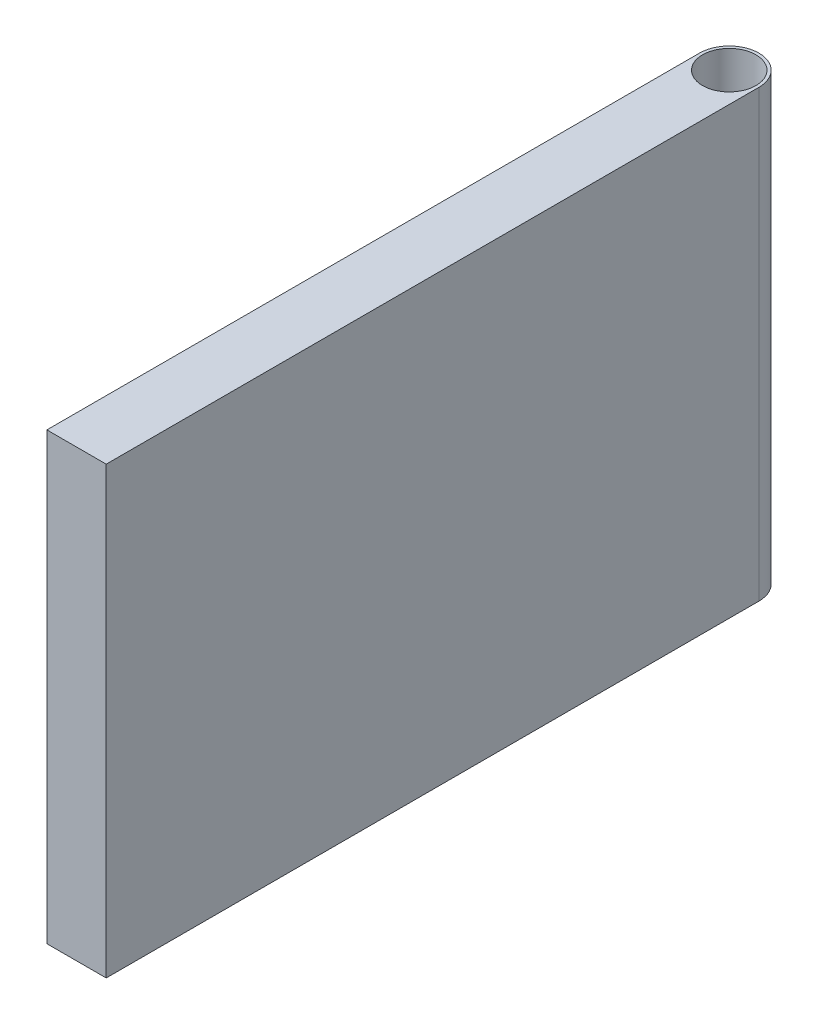
ISO-10303-21;
HEADER;
FILE_DESCRIPTION(('STEP AP214'),'2;1');
FILE_NAME('part.step','',(''),(''),'','','');
FILE_SCHEMA(('AUTOMOTIVE_DESIGN { 1 0 10303 214 1 1 1 1 }'));
ENDSEC;
DATA;
#1=APPLICATION_CONTEXT('core data for automotive mechanical design processes');
#2=APPLICATION_PROTOCOL_DEFINITION('international standard','automotive_design',2000,#1);
#3=PRODUCT_CONTEXT('',#1,'mechanical');
#4=PRODUCT('Part','Part','',(#3));
#5=PRODUCT_RELATED_PRODUCT_CATEGORY('part','',(#4));
#6=PRODUCT_DEFINITION_FORMATION('','',#4);
#7=PRODUCT_DEFINITION_CONTEXT('part definition',#1,'design');
#8=PRODUCT_DEFINITION('design','',#6,#7);
#9=PRODUCT_DEFINITION_SHAPE('','',#8);
#10=(LENGTH_UNIT() NAMED_UNIT(*) SI_UNIT(.MILLI.,.METRE.));
#11=(NAMED_UNIT(*) PLANE_ANGLE_UNIT() SI_UNIT($,.RADIAN.));
#12=(NAMED_UNIT(*) SI_UNIT($,.STERADIAN.) SOLID_ANGLE_UNIT());
#13=UNCERTAINTY_MEASURE_WITH_UNIT(LENGTH_MEASURE(1.E-05),#10,'distance_accuracy_value','');
#14=(GEOMETRIC_REPRESENTATION_CONTEXT(3) GLOBAL_UNCERTAINTY_ASSIGNED_CONTEXT((#13)) GLOBAL_UNIT_ASSIGNED_CONTEXT((#10,
#11,#12)) REPRESENTATION_CONTEXT('',''));
#15=CARTESIAN_POINT('',(0.,0.,0.));
#16=DIRECTION('',(0.,0.,1.));
#17=DIRECTION('',(1.,0.,0.));
#18=AXIS2_PLACEMENT_3D('',#15,#16,#17);
#19=CARTESIAN_POINT('',(20.,75.,110.));
#20=DIRECTION('',(0.,-1.,0.));
#21=DIRECTION('',(0.,0.,-1.));
#22=AXIS2_PLACEMENT_3D('',#19,#20,#21);
#23=PLANE('',#22);
#24=CARTESIAN_POINT('',(10.,75.,-110.));
#25=DIRECTION('',(0.,1.,0.));
#26=DIRECTION('',(0.,0.,1.));
#27=AXIS2_PLACEMENT_3D('',#24,#25,#26);
#28=CIRCLE('',#27,9.);
#29=CARTESIAN_POINT('',(10.,75.,-101.));
#30=VERTEX_POINT('',#29);
#31=EDGE_CURVE('E107',#30,#30,#28,.T.);
#32=ORIENTED_EDGE('',*,*,#31,.F.);
#33=EDGE_LOOP('',(#32));
#34=FACE_BOUND('',#33,.T.);
#35=DIRECTION('',(0.,0.,1.));
#36=VECTOR('',#35,1.);
#37=CARTESIAN_POINT('',(20.,75.,110.));
#38=LINE('',#37,#36);
#39=CARTESIAN_POINT('',(20.,75.,-110.));
#40=VERTEX_POINT('',#39);
#41=CARTESIAN_POINT('',(20.,75.,110.));
#42=VERTEX_POINT('',#41);
#43=EDGE_CURVE('E105',#40,#42,#38,.T.);
#44=ORIENTED_EDGE('',*,*,#43,.F.);
#45=CARTESIAN_POINT('',(10.,75.,-110.));
#46=DIRECTION('',(0.,1.,0.));
#47=DIRECTION('',(0.,0.,1.));
#48=AXIS2_PLACEMENT_3D('',#45,#46,#47);
#49=CIRCLE('',#48,10.);
#50=CARTESIAN_POINT('',(0.,75.,-110.));
#51=VERTEX_POINT('',#50);
#52=EDGE_CURVE('E81',#40,#51,#49,.T.);
#53=ORIENTED_EDGE('',*,*,#52,.T.);
#54=DIRECTION('',(0.,0.,1.));
#55=VECTOR('',#54,1.);
#56=CARTESIAN_POINT('',(0.,75.,110.));
#57=LINE('',#56,#55);
#58=CARTESIAN_POINT('',(0.,75.,110.));
#59=VERTEX_POINT('',#58);
#60=EDGE_CURVE('E95',#51,#59,#57,.T.);
#61=ORIENTED_EDGE('',*,*,#60,.T.);
#62=DIRECTION('',(-1.,0.,0.));
#63=VECTOR('',#62,1.);
#64=CARTESIAN_POINT('',(20.,75.,110.));
#65=LINE('',#64,#63);
#66=EDGE_CURVE('E11',#42,#59,#65,.T.);
#67=ORIENTED_EDGE('',*,*,#66,.F.);
#68=EDGE_LOOP('',(#44,#53,#61,#67));
#69=FACE_BOUND('',#68,.T.);
#70=ADVANCED_FACE('F43',(#34,#69),#23,.F.);
#71=CARTESIAN_POINT('',(20.,75.,110.));
#72=DIRECTION('',(0.,0.,-1.));
#73=DIRECTION('',(0.,1.,0.));
#74=AXIS2_PLACEMENT_3D('',#71,#72,#73);
#75=PLANE('',#74);
#76=DIRECTION('',(0.,-1.,0.));
#77=VECTOR('',#76,1.);
#78=CARTESIAN_POINT('',(0.,75.,110.));
#79=LINE('',#78,#77);
#80=CARTESIAN_POINT('',(0.,-75.,110.));
#81=VERTEX_POINT('',#80);
#82=EDGE_CURVE('E75',#59,#81,#79,.T.);
#83=ORIENTED_EDGE('',*,*,#82,.T.);
#84=DIRECTION('',(-1.,0.,0.));
#85=VECTOR('',#84,1.);
#86=CARTESIAN_POINT('',(20.,-75.,110.));
#87=LINE('',#86,#85);
#88=CARTESIAN_POINT('',(20.,-75.,110.));
#89=VERTEX_POINT('',#88);
#90=EDGE_CURVE('E51',#89,#81,#87,.T.);
#91=ORIENTED_EDGE('',*,*,#90,.F.);
#92=DIRECTION('',(0.,-1.,0.));
#93=VECTOR('',#92,1.);
#94=CARTESIAN_POINT('',(20.,75.,110.));
#95=LINE('',#94,#93);
#96=EDGE_CURVE('E56',#42,#89,#95,.T.);
#97=ORIENTED_EDGE('',*,*,#96,.F.);
#98=ORIENTED_EDGE('',*,*,#66,.T.);
#99=EDGE_LOOP('',(#83,#91,#97,#98));
#100=FACE_BOUND('',#99,.T.);
#101=ADVANCED_FACE('F122',(#100),#75,.F.);
#102=CARTESIAN_POINT('',(20.,-75.,110.));
#103=DIRECTION('',(0.,1.,0.));
#104=DIRECTION('',(0.,0.,1.));
#105=AXIS2_PLACEMENT_3D('',#102,#103,#104);
#106=PLANE('',#105);
#107=CARTESIAN_POINT('',(10.,-75.,-110.));
#108=DIRECTION('',(0.,1.,0.));
#109=DIRECTION('',(0.,0.,1.));
#110=AXIS2_PLACEMENT_3D('',#107,#108,#109);
#111=CIRCLE('',#110,9.);
#112=CARTESIAN_POINT('',(10.,-75.,-101.));
#113=VERTEX_POINT('',#112);
#114=EDGE_CURVE('E102',#113,#113,#111,.T.);
#115=ORIENTED_EDGE('',*,*,#114,.T.);
#116=EDGE_LOOP('',(#115));
#117=FACE_BOUND('',#116,.T.);
#118=DIRECTION('',(0.,0.,-1.));
#119=VECTOR('',#118,1.);
#120=CARTESIAN_POINT('',(0.,-75.,110.));
#121=LINE('',#120,#119);
#122=CARTESIAN_POINT('',(0.,-75.,-110.));
#123=VERTEX_POINT('',#122);
#124=EDGE_CURVE('E80',#81,#123,#121,.T.);
#125=ORIENTED_EDGE('',*,*,#124,.T.);
#126=CARTESIAN_POINT('',(10.,-75.,-110.));
#127=DIRECTION('',(0.,1.,0.));
#128=DIRECTION('',(0.,0.,1.));
#129=AXIS2_PLACEMENT_3D('',#126,#127,#128);
#130=CIRCLE('',#129,10.);
#131=CARTESIAN_POINT('',(20.,-75.,-110.));
#132=VERTEX_POINT('',#131);
#133=EDGE_CURVE('E99',#132,#123,#130,.T.);
#134=ORIENTED_EDGE('',*,*,#133,.F.);
#135=DIRECTION('',(0.,0.,-1.));
#136=VECTOR('',#135,1.);
#137=CARTESIAN_POINT('',(20.,-75.,110.));
#138=LINE('',#137,#136);
#139=EDGE_CURVE('E119',#89,#132,#138,.T.);
#140=ORIENTED_EDGE('',*,*,#139,.F.);
#141=ORIENTED_EDGE('',*,*,#90,.T.);
#142=EDGE_LOOP('',(#125,#134,#140,#141));
#143=FACE_BOUND('',#142,.T.);
#144=ADVANCED_FACE('F117',(#117,#143),#106,.F.);
#145=CARTESIAN_POINT('',(20.,0.,0.));
#146=DIRECTION('',(1.,0.,0.));
#147=DIRECTION('',(0.,0.,-1.));
#148=AXIS2_PLACEMENT_3D('',#145,#146,#147);
#149=PLANE('',#148);
#150=DIRECTION('',(0.,1.,0.));
#151=VECTOR('',#150,1.);
#152=CARTESIAN_POINT('',(20.,75.,-110.));
#153=LINE('',#152,#151);
#154=EDGE_CURVE('E115',#132,#40,#153,.T.);
#155=ORIENTED_EDGE('',*,*,#154,.T.);
#156=ORIENTED_EDGE('',*,*,#43,.T.);
#157=ORIENTED_EDGE('',*,*,#96,.T.);
#158=ORIENTED_EDGE('',*,*,#139,.T.);
#159=EDGE_LOOP('',(#155,#156,#157,#158));
#160=FACE_BOUND('',#159,.T.);
#161=ADVANCED_FACE('F130',(#160),#149,.T.);
#162=CARTESIAN_POINT('',(0.,0.,0.));
#163=DIRECTION('',(1.,0.,0.));
#164=DIRECTION('',(0.,0.,-1.));
#165=AXIS2_PLACEMENT_3D('',#162,#163,#164);
#166=PLANE('',#165);
#167=DIRECTION('',(0.,1.,0.));
#168=VECTOR('',#167,1.);
#169=CARTESIAN_POINT('',(0.,75.,-110.));
#170=LINE('',#169,#168);
#171=EDGE_CURVE('E94',#123,#51,#170,.T.);
#172=ORIENTED_EDGE('',*,*,#171,.F.);
#173=ORIENTED_EDGE('',*,*,#124,.F.);
#174=ORIENTED_EDGE('',*,*,#82,.F.);
#175=ORIENTED_EDGE('',*,*,#60,.F.);
#176=EDGE_LOOP('',(#172,#173,#174,#175));
#177=FACE_BOUND('',#176,.T.);
#178=ADVANCED_FACE('F91',(#177),#166,.F.);
#179=CARTESIAN_POINT('',(10.,-75.,-110.));
#180=DIRECTION('',(0.,1.,0.));
#181=DIRECTION('',(0.,0.,1.));
#182=AXIS2_PLACEMENT_3D('',#179,#180,#181);
#183=CYLINDRICAL_SURFACE('',#182,9.);
#184=ORIENTED_EDGE('',*,*,#31,.T.);
#185=EDGE_LOOP('',(#184));
#186=FACE_BOUND('',#185,.T.);
#187=ORIENTED_EDGE('',*,*,#114,.F.);
#188=EDGE_LOOP('',(#187));
#189=FACE_BOUND('',#188,.T.);
#190=ADVANCED_FACE('F132',(#186,#189),#183,.F.);
#191=CARTESIAN_POINT('',(10.,-75.,-110.));
#192=DIRECTION('',(0.,1.,0.));
#193=DIRECTION('',(0.,0.,1.));
#194=AXIS2_PLACEMENT_3D('',#191,#192,#193);
#195=CYLINDRICAL_SURFACE('',#194,10.);
#196=ORIENTED_EDGE('',*,*,#154,.F.);
#197=ORIENTED_EDGE('',*,*,#133,.T.);
#198=ORIENTED_EDGE('',*,*,#171,.T.);
#199=ORIENTED_EDGE('',*,*,#52,.F.);
#200=EDGE_LOOP('',(#196,#197,#198,#199));
#201=FACE_BOUND('',#200,.T.);
#202=ADVANCED_FACE('F97',(#201),#195,.T.);
#203=CLOSED_SHELL('',(#70,#101,#144,#161,#178,#190,#202));
#204=MANIFOLD_SOLID_BREP('B2',#203);
#205=ADVANCED_BREP_SHAPE_REPRESENTATION('',(#18,#204),#14);
#206=SHAPE_DEFINITION_REPRESENTATION(#9,#205);
ENDSEC;
END-ISO-10303-21;
